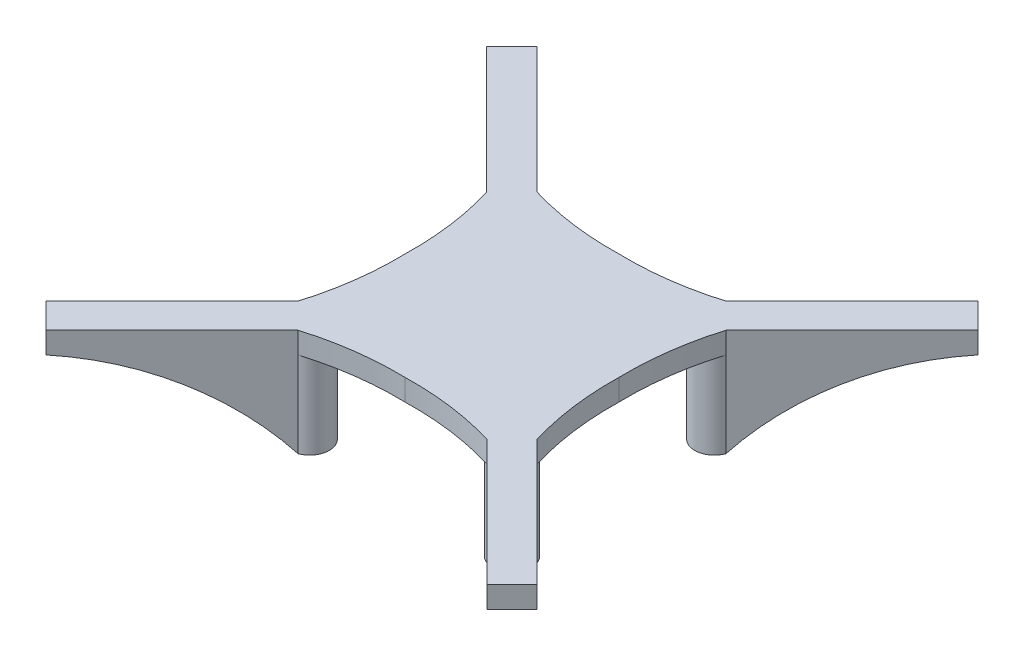
ISO-10303-21;
HEADER;
FILE_DESCRIPTION(('STEP AP214'),'2;1');
FILE_NAME('part.step','',(''),(''),'','','');
FILE_SCHEMA(('AUTOMOTIVE_DESIGN { 1 0 10303 214 1 1 1 1 }'));
ENDSEC;
DATA;
#1=APPLICATION_CONTEXT('core data for automotive mechanical design processes');
#2=APPLICATION_PROTOCOL_DEFINITION('international standard','automotive_design',2000,#1);
#3=PRODUCT_CONTEXT('',#1,'mechanical');
#4=PRODUCT('Part','Part','',(#3));
#5=PRODUCT_RELATED_PRODUCT_CATEGORY('part','',(#4));
#6=PRODUCT_DEFINITION_FORMATION('','',#4);
#7=PRODUCT_DEFINITION_CONTEXT('part definition',#1,'design');
#8=PRODUCT_DEFINITION('design','',#6,#7);
#9=PRODUCT_DEFINITION_SHAPE('','',#8);
#10=(LENGTH_UNIT() NAMED_UNIT(*) SI_UNIT(.MILLI.,.METRE.));
#11=(NAMED_UNIT(*) PLANE_ANGLE_UNIT() SI_UNIT($,.RADIAN.));
#12=(NAMED_UNIT(*) SI_UNIT($,.STERADIAN.) SOLID_ANGLE_UNIT());
#13=UNCERTAINTY_MEASURE_WITH_UNIT(LENGTH_MEASURE(1.E-05),#10,'distance_accuracy_value','');
#14=(GEOMETRIC_REPRESENTATION_CONTEXT(3) GLOBAL_UNCERTAINTY_ASSIGNED_CONTEXT((#13)) GLOBAL_UNIT_ASSIGNED_CONTEXT((#10,
#11,#12)) REPRESENTATION_CONTEXT('',''));
#15=CARTESIAN_POINT('',(0.,0.,0.));
#16=DIRECTION('',(0.,0.,1.));
#17=DIRECTION('',(1.,0.,0.));
#18=AXIS2_PLACEMENT_3D('',#15,#16,#17);
#19=CARTESIAN_POINT('',(-2.13393982171871,0.,-114.973209312331));
#20=DIRECTION('',(0.,1.,0.));
#21=DIRECTION('',(0.,0.,1.));
#22=AXIS2_PLACEMENT_3D('',#19,#20,#21);
#23=PLANE('',#22);
#24=DIRECTION('',(0.707106781186548,0.,0.707106781186547));
#25=VECTOR('',#24,1.);
#26=CARTESIAN_POINT('',(-47.6776695296649,0.,12.3223304703372));
#27=LINE('',#26,#25);
#28=CARTESIAN_POINT('',(-26.4644660940685,0.,33.5355339059336));
#29=VERTEX_POINT('',#28);
#30=CARTESIAN_POINT('',(-33.5355339059334,0.,26.4644660940676));
#31=VERTEX_POINT('',#30);
#32=EDGE_CURVE('E325',#29,#31,#27,.F.);
#33=ORIENTED_EDGE('',*,*,#32,.T.);
#34=CARTESIAN_POINT('',(-28.3798148253988,0.,28.3798148253987));
#35=DIRECTION('',(0.,1.,0.));
#36=DIRECTION('',(0.,0.,1.));
#37=AXIS2_PLACEMENT_3D('',#34,#35,#36);
#38=CIRCLE('',#37,5.5);
#39=EDGE_CURVE('E214',#29,#31,#38,.T.);
#40=ORIENTED_EDGE('',*,*,#39,.F.);
#41=EDGE_LOOP('',(#33,#40));
#42=FACE_BOUND('',#41,.T.);
#43=ADVANCED_FACE('F45',(#42),#23,.F.);
#44=DIRECTION('',(0.707106781186542,0.,-0.707106781186553));
#45=VECTOR('',#44,1.);
#46=CARTESIAN_POINT('',(12.3223304703362,0.,47.6776695296641));
#47=LINE('',#46,#45);
#48=CARTESIAN_POINT('',(33.5355339059325,0.,26.4644660940676));
#49=VERTEX_POINT('',#48);
#50=CARTESIAN_POINT('',(26.4644660940671,0.,33.535533905933));
#51=VERTEX_POINT('',#50);
#52=EDGE_CURVE('E321',#49,#51,#47,.F.);
#53=ORIENTED_EDGE('',*,*,#52,.T.);
#54=CARTESIAN_POINT('',(28.3798148253977,0.,28.3798148253983));
#55=DIRECTION('',(0.,1.,0.));
#56=DIRECTION('',(0.,0.,-1.));
#57=AXIS2_PLACEMENT_3D('',#54,#55,#56);
#58=CIRCLE('',#57,5.5);
#59=EDGE_CURVE('E233',#49,#51,#58,.T.);
#60=ORIENTED_EDGE('',*,*,#59,.F.);
#61=EDGE_LOOP('',(#53,#60));
#62=FACE_BOUND('',#61,.T.);
#63=ADVANCED_FACE('F597',(#62),#23,.F.);
#64=DIRECTION('',(-0.707106781186548,0.,-0.707106781186547));
#65=VECTOR('',#64,1.);
#66=CARTESIAN_POINT('',(47.6776695296637,0.,-12.3223304703364));
#67=LINE('',#66,#65);
#68=CARTESIAN_POINT('',(26.4644660940673,0.,-33.5355339059328));
#69=VERTEX_POINT('',#68);
#70=CARTESIAN_POINT('',(33.5355339059326,0.,-26.4644660940675));
#71=VERTEX_POINT('',#70);
#72=EDGE_CURVE('E54',#69,#71,#67,.F.);
#73=ORIENTED_EDGE('',*,*,#72,.T.);
#74=CARTESIAN_POINT('',(28.3798148253979,0.,-28.379814825398));
#75=DIRECTION('',(0.,1.,0.));
#76=DIRECTION('',(0.,0.,-1.));
#77=AXIS2_PLACEMENT_3D('',#74,#75,#76);
#78=CIRCLE('',#77,5.5);
#79=EDGE_CURVE('E338',#69,#71,#78,.T.);
#80=ORIENTED_EDGE('',*,*,#79,.F.);
#81=EDGE_LOOP('',(#73,#80));
#82=FACE_BOUND('',#81,.T.);
#83=ADVANCED_FACE('F337',(#82),#23,.F.);
#84=CARTESIAN_POINT('',(-68.9099878484196,30.,-61.8198051533944));
#85=DIRECTION('',(-0.707106781186547,0.,-0.707106781186547));
#86=DIRECTION('',(-0.707106781186548,0.,0.707106781186548));
#87=AXIS2_PLACEMENT_3D('',#84,#85,#86);
#88=PLANE('',#87);
#89=DIRECTION('',(-0.707106781186548,0.,0.707106781186547));
#90=VECTOR('',#89,1.);
#91=CARTESIAN_POINT('',(-47.6967844128232,24.,-83.0330085889909));
#92=LINE('',#91,#90);
#93=CARTESIAN_POINT('',(-61.8389200365542,24.,-68.8908729652599));
#94=VERTEX_POINT('',#93);
#95=CARTESIAN_POINT('',(-68.9099878484196,24.,-61.8198051533945));
#96=VERTEX_POINT('',#95);
#97=EDGE_CURVE('E367',#94,#96,#92,.T.);
#98=ORIENTED_EDGE('',*,*,#97,.T.);
#99=DIRECTION('',(0.,-1.,0.));
#100=VECTOR('',#99,1.);
#101=CARTESIAN_POINT('',(-68.9099878484196,30.,-61.8198051533944));
#102=LINE('',#101,#100);
#103=CARTESIAN_POINT('',(-68.9099878484196,30.,-61.8198051533944));
#104=VERTEX_POINT('',#103);
#105=EDGE_CURVE('E61',#104,#96,#102,.T.);
#106=ORIENTED_EDGE('',*,*,#105,.F.);
#107=DIRECTION('',(0.707106781186547,0.,-0.707106781186547));
#108=VECTOR('',#107,1.);
#109=CARTESIAN_POINT('',(-68.9099878484196,30.,-61.8198051533944));
#110=LINE('',#109,#108);
#111=CARTESIAN_POINT('',(-61.8389200365542,30.,-68.8908729652599));
#112=VERTEX_POINT('',#111);
#113=EDGE_CURVE('E395',#104,#112,#110,.T.);
#114=ORIENTED_EDGE('',*,*,#113,.T.);
#115=DIRECTION('',(0.,-1.,0.));
#116=VECTOR('',#115,1.);
#117=CARTESIAN_POINT('',(-61.8389200365542,30.,-68.8908729652599));
#118=LINE('',#117,#116);
#119=EDGE_CURVE('E317',#112,#94,#118,.T.);
#120=ORIENTED_EDGE('',*,*,#119,.T.);
#121=EDGE_LOOP('',(#98,#106,#114,#120));
#122=FACE_BOUND('',#121,.T.);
#123=ADVANCED_FACE('F47',(#122),#88,.T.);
#124=CARTESIAN_POINT('',(-68.9099878484196,30.,-61.8198051533944));
#125=DIRECTION('',(0.707106781186547,0.,-0.707106781186547));
#126=DIRECTION('',(-0.707106781186547,0.,-0.707106781186548));
#127=AXIS2_PLACEMENT_3D('',#124,#125,#126);
#128=PLANE('',#127);
#129=ORIENTED_EDGE('',*,*,#105,.T.);
#130=CARTESIAN_POINT('',(-72.5550291548391,-50.8226392728096,-65.464846459814));
#131=DIRECTION('',(-0.707106781186548,0.,0.707106781186547));
#132=DIRECTION('',(-0.707106781186547,0.,-0.707106781186548));
#133=AXIS2_PLACEMENT_3D('',#130,#131,#132);
#134=CIRCLE('',#133,75.);
#135=CARTESIAN_POINT('',(-33.5546487890922,0.,-26.4644660940671));
#136=VERTEX_POINT('',#135);
#137=EDGE_CURVE('E364',#136,#96,#134,.T.);
#138=ORIENTED_EDGE('',*,*,#137,.F.);
#139=DIRECTION('',(0.,-1.,0.));
#140=VECTOR('',#139,1.);
#141=CARTESIAN_POINT('',(-33.5546487890922,24.,-26.4644660940671));
#142=LINE('',#141,#140);
#143=CARTESIAN_POINT('',(-33.5546487890922,24.,-26.4644660940671));
#144=VERTEX_POINT('',#143);
#145=EDGE_CURVE('E220',#144,#136,#142,.T.);
#146=ORIENTED_EDGE('',*,*,#145,.F.);
#147=DIRECTION('',(0.,-1.,0.));
#148=VECTOR('',#147,1.);
#149=CARTESIAN_POINT('',(-33.5546487890922,30.,-26.4644660940671));
#150=LINE('',#149,#148);
#151=CARTESIAN_POINT('',(-33.5546487890922,30.,-26.4644660940671));
#152=VERTEX_POINT('',#151);
#153=EDGE_CURVE('E255',#152,#144,#150,.T.);
#154=ORIENTED_EDGE('',*,*,#153,.F.);
#155=DIRECTION('',(0.707106781186547,0.,0.707106781186547));
#156=VECTOR('',#155,1.);
#157=CARTESIAN_POINT('',(-68.9099878484196,30.,-61.8198051533944));
#158=LINE('',#157,#156);
#159=EDGE_CURVE('E68',#104,#152,#158,.T.);
#160=ORIENTED_EDGE('',*,*,#159,.F.);
#161=EDGE_LOOP('',(#129,#138,#146,#154,#160));
#162=FACE_BOUND('',#161,.T.);
#163=ADVANCED_FACE('F468',(#162),#128,.F.);
#164=CARTESIAN_POINT('',(-114.975099606415,30.,-2.05729115095129));
#165=DIRECTION('',(0.,-1.,0.));
#166=DIRECTION('',(0.,0.,-1.));
#167=AXIS2_PLACEMENT_3D('',#164,#165,#166);
#168=CYLINDRICAL_SURFACE('',#167,85.);
#169=ORIENTED_EDGE('',*,*,#153,.T.);
#170=CARTESIAN_POINT('',(-114.975099606415,24.,-2.05729115095129));
#171=DIRECTION('',(0.,1.,0.));
#172=DIRECTION('',(0.,0.,1.));
#173=AXIS2_PLACEMENT_3D('',#170,#171,#172);
#174=CIRCLE('',#173,85.);
#175=CARTESIAN_POINT('',(-30.,24.,0.));
#176=VERTEX_POINT('',#175);
#177=EDGE_CURVE('E244',#144,#176,#174,.F.);
#178=ORIENTED_EDGE('',*,*,#177,.T.);
#179=DIRECTION('',(0.,-1.,0.));
#180=VECTOR('',#179,1.);
#181=CARTESIAN_POINT('',(-30.,30.,0.));
#182=LINE('',#181,#180);
#183=CARTESIAN_POINT('',(-30.,30.,0.));
#184=VERTEX_POINT('',#183);
#185=EDGE_CURVE('E242',#184,#176,#182,.T.);
#186=ORIENTED_EDGE('',*,*,#185,.F.);
#187=CARTESIAN_POINT('',(-114.975099606415,30.,-2.05729115095129));
#188=DIRECTION('',(0.,-1.,0.));
#189=DIRECTION('',(0.,0.,-1.));
#190=AXIS2_PLACEMENT_3D('',#187,#188,#189);
#191=CIRCLE('',#190,85.);
#192=EDGE_CURVE('E455',#152,#184,#191,.T.);
#193=ORIENTED_EDGE('',*,*,#192,.F.);
#194=EDGE_LOOP('',(#169,#178,#186,#193));
#195=FACE_BOUND('',#194,.T.);
#196=ADVANCED_FACE('F465',(#195),#168,.F.);
#197=CARTESIAN_POINT('',(-114.97365046039,30.,2.1163004123836));
#198=DIRECTION('',(0.,-1.,0.));
#199=DIRECTION('',(0.,0.,-1.));
#200=AXIS2_PLACEMENT_3D('',#197,#198,#199);
#201=CYLINDRICAL_SURFACE('',#200,85.);
#202=CARTESIAN_POINT('',(-114.97365046039,24.,2.1163004123836));
#203=DIRECTION('',(0.,1.,0.));
#204=DIRECTION('',(0.,0.,1.));
#205=AXIS2_PLACEMENT_3D('',#202,#203,#204);
#206=CIRCLE('',#205,85.);
#207=CARTESIAN_POINT('',(-33.5355339059334,24.,26.4644660940676));
#208=VERTEX_POINT('',#207);
#209=EDGE_CURVE('E227',#208,#176,#206,.T.);
#210=ORIENTED_EDGE('',*,*,#209,.F.);
#211=DIRECTION('',(0.,-1.,0.));
#212=VECTOR('',#211,1.);
#213=CARTESIAN_POINT('',(-33.5355339059334,30.,26.4644660940676));
#214=LINE('',#213,#212);
#215=CARTESIAN_POINT('',(-33.5355339059334,30.,26.4644660940676));
#216=VERTEX_POINT('',#215);
#217=EDGE_CURVE('E239',#216,#208,#214,.T.);
#218=ORIENTED_EDGE('',*,*,#217,.F.);
#219=CARTESIAN_POINT('',(-114.97365046039,30.,2.1163004123836));
#220=DIRECTION('',(0.,1.,0.));
#221=DIRECTION('',(0.,0.,1.));
#222=AXIS2_PLACEMENT_3D('',#219,#220,#221);
#223=CIRCLE('',#222,85.);
#224=EDGE_CURVE('E452',#216,#184,#223,.T.);
#225=ORIENTED_EDGE('',*,*,#224,.T.);
#226=ORIENTED_EDGE('',*,*,#185,.T.);
#227=EDGE_LOOP('',(#210,#218,#225,#226));
#228=FACE_BOUND('',#227,.T.);
#229=ADVANCED_FACE('F237',(#228),#201,.F.);
#230=CARTESIAN_POINT('',(-68.8908729652608,30.,61.8198051533949));
#231=DIRECTION('',(-0.707106781186547,0.,-0.707106781186548));
#232=DIRECTION('',(-0.707106781186548,0.,0.707106781186547));
#233=AXIS2_PLACEMENT_3D('',#230,#231,#232);
#234=PLANE('',#233);
#235=CARTESIAN_POINT('',(-72.5359142716808,-50.8226392728096,65.464846459815));
#236=DIRECTION('',(-0.707106781186547,0.,-0.707106781186548));
#237=DIRECTION('',(-0.707106781186548,0.,0.707106781186547));
#238=AXIS2_PLACEMENT_3D('',#235,#236,#237);
#239=CIRCLE('',#238,75.);
#240=CARTESIAN_POINT('',(-68.8908729652602,24.,61.8198051533966));
#241=VERTEX_POINT('',#240);
#242=EDGE_CURVE('E381',#241,#31,#239,.T.);
#243=ORIENTED_EDGE('',*,*,#242,.F.);
#244=DIRECTION('',(0.,-1.,0.));
#245=VECTOR('',#244,1.);
#246=CARTESIAN_POINT('',(-68.8908729652608,30.,61.8198051533949));
#247=LINE('',#246,#245);
#248=CARTESIAN_POINT('',(-68.8908729652608,30.,61.8198051533949));
#249=VERTEX_POINT('',#248);
#250=EDGE_CURVE('E251',#249,#241,#247,.T.);
#251=ORIENTED_EDGE('',*,*,#250,.F.);
#252=DIRECTION('',(0.707106781186548,0.,-0.707106781186547));
#253=VECTOR('',#252,1.);
#254=CARTESIAN_POINT('',(-68.8908729652608,30.,61.8198051533949));
#255=LINE('',#254,#253);
#256=EDGE_CURVE('E249',#249,#216,#255,.T.);
#257=ORIENTED_EDGE('',*,*,#256,.T.);
#258=ORIENTED_EDGE('',*,*,#217,.T.);
#259=DIRECTION('',(0.,-1.,0.));
#260=VECTOR('',#259,1.);
#261=CARTESIAN_POINT('',(-33.5355339059334,24.,26.4644660940676));
#262=LINE('',#261,#260);
#263=EDGE_CURVE('E208',#208,#31,#262,.T.);
#264=ORIENTED_EDGE('',*,*,#263,.T.);
#265=EDGE_LOOP('',(#243,#251,#257,#258,#264));
#266=FACE_BOUND('',#265,.T.);
#267=ADVANCED_FACE('F247',(#266),#234,.T.);
#268=CARTESIAN_POINT('',(-61.8198051533959,30.,68.890872965261));
#269=DIRECTION('',(-0.707106781186605,0.,0.70710678118649));
#270=DIRECTION('',(0.70710678118649,0.,0.707106781186605));
#271=AXIS2_PLACEMENT_3D('',#268,#269,#270);
#272=PLANE('',#271);
#273=DIRECTION('',(0.707106781186548,0.,0.707106781186547));
#274=VECTOR('',#273,1.);
#275=CARTESIAN_POINT('',(-83.0330085889923,24.,47.6776695296646));
#276=LINE('',#275,#274);
#277=CARTESIAN_POINT('',(-61.8198051533958,24.,68.890872965261));
#278=VERTEX_POINT('',#277);
#279=EDGE_CURVE('E377',#241,#278,#276,.T.);
#280=ORIENTED_EDGE('',*,*,#279,.T.);
#281=DIRECTION('',(0.,-1.,0.));
#282=VECTOR('',#281,1.);
#283=CARTESIAN_POINT('',(-61.8198051533959,30.,68.890872965261));
#284=LINE('',#283,#282);
#285=CARTESIAN_POINT('',(-61.8198051533959,30.,68.890872965261));
#286=VERTEX_POINT('',#285);
#287=EDGE_CURVE('E258',#286,#278,#284,.T.);
#288=ORIENTED_EDGE('',*,*,#287,.F.);
#289=DIRECTION('',(-0.70710678118649,0.,-0.707106781186605));
#290=VECTOR('',#289,1.);
#291=CARTESIAN_POINT('',(-61.8198051533959,30.,68.890872965261));
#292=LINE('',#291,#290);
#293=EDGE_CURVE('E446',#286,#249,#292,.T.);
#294=ORIENTED_EDGE('',*,*,#293,.T.);
#295=ORIENTED_EDGE('',*,*,#250,.T.);
#296=EDGE_LOOP('',(#280,#288,#294,#295));
#297=FACE_BOUND('',#296,.T.);
#298=ADVANCED_FACE('F634',(#297),#272,.T.);
#299=CARTESIAN_POINT('',(-61.8198051533959,30.,68.890872965261));
#300=DIRECTION('',(-0.707106781186547,0.,-0.707106781186547));
#301=DIRECTION('',(-0.707106781186548,0.,0.707106781186548));
#302=AXIS2_PLACEMENT_3D('',#299,#300,#301);
#303=PLANE('',#302);
#304=ORIENTED_EDGE('',*,*,#287,.T.);
#305=CARTESIAN_POINT('',(-65.4648464598153,-50.8226392728096,72.5359142716805));
#306=DIRECTION('',(0.707106781186548,0.,0.707106781186547));
#307=DIRECTION('',(-0.707106781186547,0.,0.707106781186548));
#308=AXIS2_PLACEMENT_3D('',#305,#306,#307);
#309=CIRCLE('',#308,75.);
#310=EDGE_CURVE('E374',#29,#278,#309,.T.);
#311=ORIENTED_EDGE('',*,*,#310,.F.);
#312=DIRECTION('',(0.,-1.,0.));
#313=VECTOR('',#312,1.);
#314=CARTESIAN_POINT('',(-26.4644660940685,24.,33.5355339059336));
#315=LINE('',#314,#313);
#316=CARTESIAN_POINT('',(-26.4644660940685,24.,33.5355339059336));
#317=VERTEX_POINT('',#316);
#318=EDGE_CURVE('E486',#317,#29,#315,.T.);
#319=ORIENTED_EDGE('',*,*,#318,.F.);
#320=DIRECTION('',(0.,-1.,0.));
#321=VECTOR('',#320,1.);
#322=CARTESIAN_POINT('',(-26.4644660940685,30.,33.5355339059336));
#323=LINE('',#322,#321);
#324=CARTESIAN_POINT('',(-26.4644660940685,30.,33.5355339059336));
#325=VERTEX_POINT('',#324);
#326=EDGE_CURVE('E265',#325,#317,#323,.T.);
#327=ORIENTED_EDGE('',*,*,#326,.F.);
#328=DIRECTION('',(0.707106781186547,0.,-0.707106781186547));
#329=VECTOR('',#328,1.);
#330=CARTESIAN_POINT('',(-61.8198051533959,30.,68.890872965261));
#331=LINE('',#330,#329);
#332=EDGE_CURVE('E443',#286,#325,#331,.T.);
#333=ORIENTED_EDGE('',*,*,#332,.F.);
#334=EDGE_LOOP('',(#304,#311,#319,#327,#333));
#335=FACE_BOUND('',#334,.T.);
#336=ADVANCED_FACE('F636',(#335),#303,.F.);
#337=CARTESIAN_POINT('',(-2.11630041238379,30.,114.97365046039));
#338=DIRECTION('',(0.,-1.,0.));
#339=DIRECTION('',(0.,0.,-1.));
#340=AXIS2_PLACEMENT_3D('',#337,#338,#339);
#341=CYLINDRICAL_SURFACE('',#340,85.);
#342=ORIENTED_EDGE('',*,*,#326,.T.);
#343=CARTESIAN_POINT('',(-2.11630041238379,24.,114.97365046039));
#344=DIRECTION('',(0.,1.,0.));
#345=DIRECTION('',(0.,0.,1.));
#346=AXIS2_PLACEMENT_3D('',#343,#344,#345);
#347=CIRCLE('',#346,85.);
#348=CARTESIAN_POINT('',(0.,24.,30.));
#349=VERTEX_POINT('',#348);
#350=EDGE_CURVE('E230',#317,#349,#347,.F.);
#351=ORIENTED_EDGE('',*,*,#350,.T.);
#352=DIRECTION('',(0.,-1.,0.));
#353=VECTOR('',#352,1.);
#354=CARTESIAN_POINT('',(0.,30.,30.));
#355=LINE('',#354,#353);
#356=CARTESIAN_POINT('',(0.,30.,30.));
#357=VERTEX_POINT('',#356);
#358=EDGE_CURVE('E269',#357,#349,#355,.T.);
#359=ORIENTED_EDGE('',*,*,#358,.F.);
#360=CARTESIAN_POINT('',(-2.11630041238379,30.,114.97365046039));
#361=DIRECTION('',(0.,-1.,0.));
#362=DIRECTION('',(0.,0.,-1.));
#363=AXIS2_PLACEMENT_3D('',#360,#361,#362);
#364=CIRCLE('',#363,85.);
#365=EDGE_CURVE('E440',#325,#357,#364,.T.);
#366=ORIENTED_EDGE('',*,*,#365,.F.);
#367=EDGE_LOOP('',(#342,#351,#359,#366));
#368=FACE_BOUND('',#367,.T.);
#369=ADVANCED_FACE('F499',(#368),#341,.F.);
#370=CARTESIAN_POINT('',(2.11630041238427,30.,114.97365046039));
#371=DIRECTION('',(0.,-1.,0.));
#372=DIRECTION('',(0.,0.,-1.));
#373=AXIS2_PLACEMENT_3D('',#370,#371,#372);
#374=CYLINDRICAL_SURFACE('',#373,85.);
#375=CARTESIAN_POINT('',(2.11630041238427,24.,114.97365046039));
#376=DIRECTION('',(0.,1.,0.));
#377=DIRECTION('',(0.,0.,1.));
#378=AXIS2_PLACEMENT_3D('',#375,#376,#377);
#379=CIRCLE('',#378,85.);
#380=CARTESIAN_POINT('',(26.4644660940671,24.,33.535533905933));
#381=VERTEX_POINT('',#380);
#382=EDGE_CURVE('E493',#381,#349,#379,.T.);
#383=ORIENTED_EDGE('',*,*,#382,.F.);
#384=DIRECTION('',(0.,-1.,0.));
#385=VECTOR('',#384,1.);
#386=CARTESIAN_POINT('',(26.4644660940671,30.,33.535533905933));
#387=LINE('',#386,#385);
#388=CARTESIAN_POINT('',(26.4644660940671,30.,33.535533905933));
#389=VERTEX_POINT('',#388);
#390=EDGE_CURVE('E273',#389,#381,#387,.T.);
#391=ORIENTED_EDGE('',*,*,#390,.F.);
#392=CARTESIAN_POINT('',(2.11630041238427,30.,114.97365046039));
#393=DIRECTION('',(0.,1.,0.));
#394=DIRECTION('',(0.,0.,1.));
#395=AXIS2_PLACEMENT_3D('',#392,#393,#394);
#396=CIRCLE('',#395,85.);
#397=EDGE_CURVE('E436',#389,#357,#396,.T.);
#398=ORIENTED_EDGE('',*,*,#397,.T.);
#399=ORIENTED_EDGE('',*,*,#358,.T.);
#400=EDGE_LOOP('',(#383,#391,#398,#399));
#401=FACE_BOUND('',#400,.T.);
#402=ADVANCED_FACE('F504',(#401),#374,.F.);
#403=CARTESIAN_POINT('',(61.8198051533946,30.,68.89087296526));
#404=DIRECTION('',(-0.707106781186542,0.,0.707106781186553));
#405=DIRECTION('',(0.707106781186553,0.,0.707106781186542));
#406=AXIS2_PLACEMENT_3D('',#403,#404,#405);
#407=PLANE('',#406);
#408=CARTESIAN_POINT('',(65.4648464598143,-50.8226392728096,72.5359142716796));
#409=DIRECTION('',(-0.707106781186542,0.,0.707106781186553));
#410=DIRECTION('',(0.707106781186553,0.,0.707106781186542));
#411=AXIS2_PLACEMENT_3D('',#408,#409,#410);
#412=CIRCLE('',#411,75.);
#413=CARTESIAN_POINT('',(61.8198051533946,24.,68.89087296526));
#414=VERTEX_POINT('',#413);
#415=EDGE_CURVE('E391',#414,#51,#412,.T.);
#416=ORIENTED_EDGE('',*,*,#415,.F.);
#417=DIRECTION('',(0.,-1.,0.));
#418=VECTOR('',#417,1.);
#419=CARTESIAN_POINT('',(61.8198051533946,30.,68.89087296526));
#420=LINE('',#419,#418);
#421=CARTESIAN_POINT('',(61.8198051533946,30.,68.89087296526));
#422=VERTEX_POINT('',#421);
#423=EDGE_CURVE('E277',#422,#414,#420,.T.);
#424=ORIENTED_EDGE('',*,*,#423,.F.);
#425=DIRECTION('',(-0.707106781186553,0.,-0.707106781186542));
#426=VECTOR('',#425,1.);
#427=CARTESIAN_POINT('',(61.8198051533946,30.,68.89087296526));
#428=LINE('',#427,#426);
#429=EDGE_CURVE('E432',#422,#389,#428,.T.);
#430=ORIENTED_EDGE('',*,*,#429,.T.);
#431=ORIENTED_EDGE('',*,*,#390,.T.);
#432=DIRECTION('',(0.,-1.,0.));
#433=VECTOR('',#432,1.);
#434=CARTESIAN_POINT('',(26.4644660940671,24.,33.535533905933));
#435=LINE('',#434,#433);
#436=EDGE_CURVE('E568',#381,#51,#435,.T.);
#437=ORIENTED_EDGE('',*,*,#436,.T.);
#438=EDGE_LOOP('',(#416,#424,#430,#431,#437));
#439=FACE_BOUND('',#438,.T.);
#440=ADVANCED_FACE('F510',(#439),#407,.T.);
#441=CARTESIAN_POINT('',(61.8198051533946,30.,68.89087296526));
#442=DIRECTION('',(-0.707106781186553,0.,-0.707106781186542));
#443=DIRECTION('',(-0.707106781186542,0.,0.707106781186553));
#444=AXIS2_PLACEMENT_3D('',#441,#442,#443);
#445=PLANE('',#444);
#446=ORIENTED_EDGE('',*,*,#423,.T.);
#447=DIRECTION('',(0.707106781186542,0.,-0.707106781186553));
#448=VECTOR('',#447,1.);
#449=CARTESIAN_POINT('',(47.6776695296637,24.,83.0330085889911));
#450=LINE('',#449,#448);
#451=CARTESIAN_POINT('',(68.8908729652599,24.,61.8198051533945));
#452=VERTEX_POINT('',#451);
#453=EDGE_CURVE('E387',#414,#452,#450,.T.);
#454=ORIENTED_EDGE('',*,*,#453,.T.);
#455=DIRECTION('',(0.,-1.,0.));
#456=VECTOR('',#455,1.);
#457=CARTESIAN_POINT('',(68.89087296526,30.,61.8198051533945));
#458=LINE('',#457,#456);
#459=CARTESIAN_POINT('',(68.89087296526,30.,61.8198051533945));
#460=VERTEX_POINT('',#459);
#461=EDGE_CURVE('E281',#460,#452,#458,.T.);
#462=ORIENTED_EDGE('',*,*,#461,.F.);
#463=DIRECTION('',(0.707106781186542,0.,-0.707106781186553));
#464=VECTOR('',#463,1.);
#465=CARTESIAN_POINT('',(61.8198051533946,30.,68.89087296526));
#466=LINE('',#465,#464);
#467=EDGE_CURVE('E429',#422,#460,#466,.T.);
#468=ORIENTED_EDGE('',*,*,#467,.F.);
#469=EDGE_LOOP('',(#446,#454,#462,#468));
#470=FACE_BOUND('',#469,.T.);
#471=ADVANCED_FACE('F515',(#470),#445,.F.);
#472=CARTESIAN_POINT('',(68.89087296526,30.,61.8198051533945));
#473=DIRECTION('',(-0.707106781186542,0.,0.707106781186553));
#474=DIRECTION('',(0.707106781186553,0.,0.707106781186542));
#475=AXIS2_PLACEMENT_3D('',#472,#473,#474);
#476=PLANE('',#475);
#477=ORIENTED_EDGE('',*,*,#461,.T.);
#478=CARTESIAN_POINT('',(72.5359142716797,-50.8226392728096,65.4648464598142));
#479=DIRECTION('',(0.707106781186542,0.,-0.707106781186553));
#480=DIRECTION('',(0.707106781186553,0.,0.707106781186542));
#481=AXIS2_PLACEMENT_3D('',#478,#479,#480);
#482=CIRCLE('',#481,75.);
#483=EDGE_CURVE('E384',#49,#452,#482,.T.);
#484=ORIENTED_EDGE('',*,*,#483,.F.);
#485=DIRECTION('',(0.,-1.,0.));
#486=VECTOR('',#485,1.);
#487=CARTESIAN_POINT('',(33.5355339059325,24.,26.4644660940676));
#488=LINE('',#487,#486);
#489=CARTESIAN_POINT('',(33.5355339059325,24.,26.4644660940676));
#490=VERTEX_POINT('',#489);
#491=EDGE_CURVE('E525',#490,#49,#488,.T.);
#492=ORIENTED_EDGE('',*,*,#491,.F.);
#493=DIRECTION('',(0.,-1.,0.));
#494=VECTOR('',#493,1.);
#495=CARTESIAN_POINT('',(33.5355339059325,30.,26.4644660940676));
#496=LINE('',#495,#494);
#497=CARTESIAN_POINT('',(33.5355339059325,30.,26.4644660940676));
#498=VERTEX_POINT('',#497);
#499=EDGE_CURVE('E285',#498,#490,#496,.T.);
#500=ORIENTED_EDGE('',*,*,#499,.F.);
#501=DIRECTION('',(-0.707106781186553,0.,-0.707106781186542));
#502=VECTOR('',#501,1.);
#503=CARTESIAN_POINT('',(68.89087296526,30.,61.8198051533945));
#504=LINE('',#503,#502);
#505=EDGE_CURVE('E426',#460,#498,#504,.T.);
#506=ORIENTED_EDGE('',*,*,#505,.F.);
#507=EDGE_LOOP('',(#477,#484,#492,#500,#506));
#508=FACE_BOUND('',#507,.T.);
#509=ADVANCED_FACE('F523',(#508),#476,.F.);
#510=CARTESIAN_POINT('',(114.97365046039,30.,2.11630041238641));
#511=DIRECTION('',(0.,-1.,0.));
#512=DIRECTION('',(0.,0.,-1.));
#513=AXIS2_PLACEMENT_3D('',#510,#511,#512);
#514=CYLINDRICAL_SURFACE('',#513,85.);
#515=ORIENTED_EDGE('',*,*,#499,.T.);
#516=CARTESIAN_POINT('',(114.97365046039,24.,2.11630041238641));
#517=DIRECTION('',(0.,1.,0.));
#518=DIRECTION('',(0.,0.,1.));
#519=AXIS2_PLACEMENT_3D('',#516,#517,#518);
#520=CIRCLE('',#519,85.);
#521=CARTESIAN_POINT('',(30.,24.,0.));
#522=VERTEX_POINT('',#521);
#523=EDGE_CURVE('E489',#490,#522,#520,.F.);
#524=ORIENTED_EDGE('',*,*,#523,.T.);
#525=DIRECTION('',(0.,-1.,0.));
#526=VECTOR('',#525,1.);
#527=CARTESIAN_POINT('',(30.,30.,0.));
#528=LINE('',#527,#526);
#529=CARTESIAN_POINT('',(30.,30.,0.));
#530=VERTEX_POINT('',#529);
#531=EDGE_CURVE('E289',#530,#522,#528,.T.);
#532=ORIENTED_EDGE('',*,*,#531,.F.);
#533=CARTESIAN_POINT('',(114.97365046039,30.,2.11630041238641));
#534=DIRECTION('',(0.,-1.,0.));
#535=DIRECTION('',(0.,0.,-1.));
#536=AXIS2_PLACEMENT_3D('',#533,#534,#535);
#537=CIRCLE('',#536,85.);
#538=EDGE_CURVE('E423',#498,#530,#537,.T.);
#539=ORIENTED_EDGE('',*,*,#538,.F.);
#540=EDGE_LOOP('',(#515,#524,#532,#539));
#541=FACE_BOUND('',#540,.T.);
#542=ADVANCED_FACE('F527',(#541),#514,.F.);
#543=CARTESIAN_POINT('',(114.97365046039,30.,-2.11630041238581));
#544=DIRECTION('',(0.,-1.,0.));
#545=DIRECTION('',(0.,0.,-1.));
#546=AXIS2_PLACEMENT_3D('',#543,#544,#545);
#547=CYLINDRICAL_SURFACE('',#546,85.);
#548=CARTESIAN_POINT('',(114.97365046039,24.,-2.11630041238581));
#549=DIRECTION('',(0.,1.,0.));
#550=DIRECTION('',(0.,0.,1.));
#551=AXIS2_PLACEMENT_3D('',#548,#549,#550);
#552=CIRCLE('',#551,85.);
#553=CARTESIAN_POINT('',(33.5355339059326,24.,-26.4644660940675));
#554=VERTEX_POINT('',#553);
#555=EDGE_CURVE('E485',#554,#522,#552,.T.);
#556=ORIENTED_EDGE('',*,*,#555,.F.);
#557=DIRECTION('',(0.,-1.,0.));
#558=VECTOR('',#557,1.);
#559=CARTESIAN_POINT('',(33.5355339059326,30.,-26.4644660940675));
#560=LINE('',#559,#558);
#561=CARTESIAN_POINT('',(33.5355339059326,30.,-26.4644660940675));
#562=VERTEX_POINT('',#561);
#563=EDGE_CURVE('E293',#562,#554,#560,.T.);
#564=ORIENTED_EDGE('',*,*,#563,.F.);
#565=CARTESIAN_POINT('',(114.97365046039,30.,-2.11630041238581));
#566=DIRECTION('',(0.,1.,0.));
#567=DIRECTION('',(0.,0.,1.));
#568=AXIS2_PLACEMENT_3D('',#565,#566,#567);
#569=CIRCLE('',#568,85.);
#570=EDGE_CURVE('E419',#562,#530,#569,.T.);
#571=ORIENTED_EDGE('',*,*,#570,.T.);
#572=ORIENTED_EDGE('',*,*,#531,.T.);
#573=EDGE_LOOP('',(#556,#564,#571,#572));
#574=FACE_BOUND('',#573,.T.);
#575=ADVANCED_FACE('F530',(#574),#547,.F.);
#576=CARTESIAN_POINT('',(68.89087296526,30.,-61.8198051533949));
#577=DIRECTION('',(0.707106781186547,0.,0.707106781186547));
#578=DIRECTION('',(0.707106781186547,0.,-0.707106781186548));
#579=AXIS2_PLACEMENT_3D('',#576,#577,#578);
#580=PLANE('',#579);
#581=CARTESIAN_POINT('',(72.5359142716795,-50.8226392728096,-65.4648464598144));
#582=DIRECTION('',(0.707106781186547,0.,0.707106781186547));
#583=DIRECTION('',(0.707106781186547,0.,-0.707106781186548));
#584=AXIS2_PLACEMENT_3D('',#581,#582,#583);
#585=CIRCLE('',#584,75.);
#586=CARTESIAN_POINT('',(68.89087296526,24.,-61.8198051533949));
#587=VERTEX_POINT('',#586);
#588=EDGE_CURVE('E346',#587,#71,#585,.T.);
#589=ORIENTED_EDGE('',*,*,#588,.F.);
#590=DIRECTION('',(0.,-1.,0.));
#591=VECTOR('',#590,1.);
#592=CARTESIAN_POINT('',(68.89087296526,30.,-61.8198051533949));
#593=LINE('',#592,#591);
#594=CARTESIAN_POINT('',(68.89087296526,30.,-61.8198051533949));
#595=VERTEX_POINT('',#594);
#596=EDGE_CURVE('E297',#595,#587,#593,.T.);
#597=ORIENTED_EDGE('',*,*,#596,.F.);
#598=DIRECTION('',(-0.707106781186547,0.,0.707106781186547));
#599=VECTOR('',#598,1.);
#600=CARTESIAN_POINT('',(68.89087296526,30.,-61.8198051533949));
#601=LINE('',#600,#599);
#602=EDGE_CURVE('E415',#595,#562,#601,.T.);
#603=ORIENTED_EDGE('',*,*,#602,.T.);
#604=ORIENTED_EDGE('',*,*,#563,.T.);
#605=DIRECTION('',(0.,-1.,0.));
#606=VECTOR('',#605,1.);
#607=CARTESIAN_POINT('',(33.5355339059326,24.,-26.4644660940675));
#608=LINE('',#607,#606);
#609=EDGE_CURVE('E573',#554,#71,#608,.T.);
#610=ORIENTED_EDGE('',*,*,#609,.T.);
#611=EDGE_LOOP('',(#589,#597,#603,#604,#610));
#612=FACE_BOUND('',#611,.T.);
#613=ADVANCED_FACE('F533',(#612),#580,.T.);
#614=CARTESIAN_POINT('',(68.89087296526,30.,-61.8198051533949));
#615=DIRECTION('',(-0.707106781186547,0.,0.707106781186547));
#616=DIRECTION('',(0.707106781186548,0.,0.707106781186548));
#617=AXIS2_PLACEMENT_3D('',#614,#615,#616);
#618=PLANE('',#617);
#619=ORIENTED_EDGE('',*,*,#596,.T.);
#620=DIRECTION('',(-0.707106781186548,0.,-0.707106781186547));
#621=VECTOR('',#620,1.);
#622=CARTESIAN_POINT('',(83.0330085889911,24.,-47.6776695296638));
#623=LINE('',#622,#621);
#624=CARTESIAN_POINT('',(61.8198051533946,24.,-68.8908729652602));
#625=VERTEX_POINT('',#624);
#626=EDGE_CURVE('E355',#587,#625,#623,.T.);
#627=ORIENTED_EDGE('',*,*,#626,.T.);
#628=DIRECTION('',(0.,-1.,0.));
#629=VECTOR('',#628,1.);
#630=CARTESIAN_POINT('',(61.8198051533946,30.,-68.8908729652602));
#631=LINE('',#630,#629);
#632=CARTESIAN_POINT('',(61.8198051533946,30.,-68.8908729652602));
#633=VERTEX_POINT('',#632);
#634=EDGE_CURVE('E301',#633,#625,#631,.T.);
#635=ORIENTED_EDGE('',*,*,#634,.F.);
#636=DIRECTION('',(-0.707106781186548,0.,-0.707106781186548));
#637=VECTOR('',#636,1.);
#638=CARTESIAN_POINT('',(68.89087296526,30.,-61.8198051533949));
#639=LINE('',#638,#637);
#640=EDGE_CURVE('E412',#595,#633,#639,.T.);
#641=ORIENTED_EDGE('',*,*,#640,.F.);
#642=EDGE_LOOP('',(#619,#627,#635,#641));
#643=FACE_BOUND('',#642,.T.);
#644=ADVANCED_FACE('F537',(#643),#618,.F.);
#645=CARTESIAN_POINT('',(61.8198051533946,30.,-68.8908729652602));
#646=DIRECTION('',(0.707106781186548,0.,0.707106781186547));
#647=DIRECTION('',(0.707106781186547,0.,-0.707106781186548));
#648=AXIS2_PLACEMENT_3D('',#645,#646,#647);
#649=PLANE('',#648);
#650=ORIENTED_EDGE('',*,*,#634,.T.);
#651=CARTESIAN_POINT('',(65.4648464598142,-50.8226392728096,-72.5359142716797));
#652=DIRECTION('',(-0.707106781186548,0.,-0.707106781186547));
#653=DIRECTION('',(0.707106781186547,0.,-0.707106781186548));
#654=AXIS2_PLACEMENT_3D('',#651,#652,#653);
#655=CIRCLE('',#654,75.);
#656=EDGE_CURVE('E343',#69,#625,#655,.T.);
#657=ORIENTED_EDGE('',*,*,#656,.F.);
#658=DIRECTION('',(0.,-1.,0.));
#659=VECTOR('',#658,1.);
#660=CARTESIAN_POINT('',(26.4644660940673,24.,-33.5355339059328));
#661=LINE('',#660,#659);
#662=CARTESIAN_POINT('',(26.4644660940673,24.,-33.5355339059328));
#663=VERTEX_POINT('',#662);
#664=EDGE_CURVE('E351',#663,#69,#661,.T.);
#665=ORIENTED_EDGE('',*,*,#664,.F.);
#666=DIRECTION('',(0.,-1.,0.));
#667=VECTOR('',#666,1.);
#668=CARTESIAN_POINT('',(26.4644660940673,30.,-33.5355339059328));
#669=LINE('',#668,#667);
#670=CARTESIAN_POINT('',(26.4644660940673,30.,-33.5355339059328));
#671=VERTEX_POINT('',#670);
#672=EDGE_CURVE('E305',#671,#663,#669,.T.);
#673=ORIENTED_EDGE('',*,*,#672,.F.);
#674=DIRECTION('',(-0.707106781186547,0.,0.707106781186548));
#675=VECTOR('',#674,1.);
#676=CARTESIAN_POINT('',(61.8198051533946,30.,-68.8908729652602));
#677=LINE('',#676,#675);
#678=EDGE_CURVE('E409',#633,#671,#677,.T.);
#679=ORIENTED_EDGE('',*,*,#678,.F.);
#680=EDGE_LOOP('',(#650,#657,#665,#673,#679));
#681=FACE_BOUND('',#680,.T.);
#682=ADVANCED_FACE('F349',(#681),#649,.F.);
#683=CARTESIAN_POINT('',(2.11630041238509,30.,-114.97365046039));
#684=DIRECTION('',(0.,-1.,0.));
#685=DIRECTION('',(0.,0.,-1.));
#686=AXIS2_PLACEMENT_3D('',#683,#684,#685);
#687=CYLINDRICAL_SURFACE('',#686,85.);
#688=ORIENTED_EDGE('',*,*,#672,.T.);
#689=CARTESIAN_POINT('',(2.11630041238509,24.,-114.97365046039));
#690=DIRECTION('',(0.,1.,0.));
#691=DIRECTION('',(0.,0.,1.));
#692=AXIS2_PLACEMENT_3D('',#689,#690,#691);
#693=CIRCLE('',#692,85.);
#694=CARTESIAN_POINT('',(0.,24.,-30.));
#695=VERTEX_POINT('',#694);
#696=EDGE_CURVE('E481',#663,#695,#693,.F.);
#697=ORIENTED_EDGE('',*,*,#696,.T.);
#698=DIRECTION('',(0.,-1.,0.));
#699=VECTOR('',#698,1.);
#700=CARTESIAN_POINT('',(0.,30.,-30.));
#701=LINE('',#700,#699);
#702=CARTESIAN_POINT('',(0.,30.,-30.));
#703=VERTEX_POINT('',#702);
#704=EDGE_CURVE('E309',#703,#695,#701,.T.);
#705=ORIENTED_EDGE('',*,*,#704,.F.);
#706=CARTESIAN_POINT('',(2.11630041238509,30.,-114.97365046039));
#707=DIRECTION('',(0.,-1.,0.));
#708=DIRECTION('',(0.,0.,-1.));
#709=AXIS2_PLACEMENT_3D('',#706,#707,#708);
#710=CIRCLE('',#709,85.);
#711=EDGE_CURVE('E406',#671,#703,#710,.T.);
#712=ORIENTED_EDGE('',*,*,#711,.F.);
#713=EDGE_LOOP('',(#688,#697,#705,#712));
#714=FACE_BOUND('',#713,.T.);
#715=ADVANCED_FACE('F542',(#714),#687,.F.);
#716=CARTESIAN_POINT('',(-2.13393982171871,30.,-114.973209312331));
#717=DIRECTION('',(0.,-1.,0.));
#718=DIRECTION('',(0.,0.,-1.));
#719=AXIS2_PLACEMENT_3D('',#716,#717,#718);
#720=CYLINDRICAL_SURFACE('',#719,85.);
#721=CARTESIAN_POINT('',(-2.13393982171871,24.,-114.973209312331));
#722=DIRECTION('',(0.,1.,0.));
#723=DIRECTION('',(0.,0.,1.));
#724=AXIS2_PLACEMENT_3D('',#721,#722,#723);
#725=CIRCLE('',#724,85.);
#726=CARTESIAN_POINT('',(-26.4835809772268,24.,-33.5355339059325));
#727=VERTEX_POINT('',#726);
#728=EDGE_CURVE('E11',#727,#695,#725,.T.);
#729=ORIENTED_EDGE('',*,*,#728,.F.);
#730=DIRECTION('',(0.,-1.,0.));
#731=VECTOR('',#730,1.);
#732=CARTESIAN_POINT('',(-26.4835809772268,30.,-33.5355339059325));
#733=LINE('',#732,#731);
#734=CARTESIAN_POINT('',(-26.4835809772268,30.,-33.5355339059325));
#735=VERTEX_POINT('',#734);
#736=EDGE_CURVE('E313',#735,#727,#733,.T.);
#737=ORIENTED_EDGE('',*,*,#736,.F.);
#738=CARTESIAN_POINT('',(-2.13393982171871,30.,-114.973209312331));
#739=DIRECTION('',(0.,1.,0.));
#740=DIRECTION('',(0.,0.,1.));
#741=AXIS2_PLACEMENT_3D('',#738,#739,#740);
#742=CIRCLE('',#741,85.);
#743=EDGE_CURVE('E402',#735,#703,#742,.T.);
#744=ORIENTED_EDGE('',*,*,#743,.T.);
#745=ORIENTED_EDGE('',*,*,#704,.T.);
#746=EDGE_LOOP('',(#729,#737,#744,#745));
#747=FACE_BOUND('',#746,.T.);
#748=ADVANCED_FACE('F545',(#747),#720,.F.);
#749=CARTESIAN_POINT('',(-61.8389200365542,30.,-68.8908729652599));
#750=DIRECTION('',(0.707106781186547,0.,-0.707106781186547));
#751=DIRECTION('',(-0.707106781186548,0.,-0.707106781186548));
#752=AXIS2_PLACEMENT_3D('',#749,#750,#751);
#753=PLANE('',#752);
#754=CARTESIAN_POINT('',(-65.4839613429737,-50.8226392728096,-72.5359142716794));
#755=DIRECTION('',(0.707106781186547,0.,-0.707106781186547));
#756=DIRECTION('',(-0.707106781186548,0.,-0.707106781186548));
#757=AXIS2_PLACEMENT_3D('',#754,#755,#756);
#758=CIRCLE('',#757,75.);
#759=CARTESIAN_POINT('',(-26.4835809772268,0.,-33.5355339059325));
#760=VERTEX_POINT('',#759);
#761=EDGE_CURVE('E370',#94,#760,#758,.T.);
#762=ORIENTED_EDGE('',*,*,#761,.F.);
#763=ORIENTED_EDGE('',*,*,#119,.F.);
#764=DIRECTION('',(0.707106781186547,0.,0.707106781186547));
#765=VECTOR('',#764,1.);
#766=CARTESIAN_POINT('',(-61.8389200365542,30.,-68.8908729652599));
#767=LINE('',#766,#765);
#768=EDGE_CURVE('E398',#112,#735,#767,.T.);
#769=ORIENTED_EDGE('',*,*,#768,.T.);
#770=ORIENTED_EDGE('',*,*,#736,.T.);
#771=DIRECTION('',(0.,-1.,0.));
#772=VECTOR('',#771,1.);
#773=CARTESIAN_POINT('',(-26.4835809772268,24.,-33.5355339059325));
#774=LINE('',#773,#772);
#775=EDGE_CURVE('E474',#727,#760,#774,.T.);
#776=ORIENTED_EDGE('',*,*,#775,.T.);
#777=EDGE_LOOP('',(#762,#763,#769,#770,#776));
#778=FACE_BOUND('',#777,.T.);
#779=ADVANCED_FACE('F549',(#778),#753,.T.);
#780=CARTESIAN_POINT('',(-2.13393982171871,30.,-114.973209312331));
#781=DIRECTION('',(0.,1.,0.));
#782=DIRECTION('',(0.,0.,1.));
#783=AXIS2_PLACEMENT_3D('',#780,#781,#782);
#784=PLANE('',#783);
#785=ORIENTED_EDGE('',*,*,#113,.F.);
#786=ORIENTED_EDGE('',*,*,#159,.T.);
#787=ORIENTED_EDGE('',*,*,#192,.T.);
#788=ORIENTED_EDGE('',*,*,#224,.F.);
#789=ORIENTED_EDGE('',*,*,#256,.F.);
#790=ORIENTED_EDGE('',*,*,#293,.F.);
#791=ORIENTED_EDGE('',*,*,#332,.T.);
#792=ORIENTED_EDGE('',*,*,#365,.T.);
#793=ORIENTED_EDGE('',*,*,#397,.F.);
#794=ORIENTED_EDGE('',*,*,#429,.F.);
#795=ORIENTED_EDGE('',*,*,#467,.T.);
#796=ORIENTED_EDGE('',*,*,#505,.T.);
#797=ORIENTED_EDGE('',*,*,#538,.T.);
#798=ORIENTED_EDGE('',*,*,#570,.F.);
#799=ORIENTED_EDGE('',*,*,#602,.F.);
#800=ORIENTED_EDGE('',*,*,#640,.T.);
#801=ORIENTED_EDGE('',*,*,#678,.T.);
#802=ORIENTED_EDGE('',*,*,#711,.T.);
#803=ORIENTED_EDGE('',*,*,#743,.F.);
#804=ORIENTED_EDGE('',*,*,#768,.F.);
#805=EDGE_LOOP('',(#785,#786,#787,#788,#789,#790,#791,#792,#793,#794,#795,#796,#797,#798,#799,
#800,#801,#802,#803,#804));
#806=FACE_BOUND('',#805,.T.);
#807=ADVANCED_FACE('F507',(#806),#784,.T.);
#808=DIRECTION('',(-0.707106781186548,0.,0.707106781186547));
#809=VECTOR('',#808,1.);
#810=CARTESIAN_POINT('',(-12.3414453534958,0.,-47.6776695296635));
#811=LINE('',#810,#809);
#812=EDGE_CURVE('E329',#136,#760,#811,.F.);
#813=ORIENTED_EDGE('',*,*,#812,.T.);
#814=CARTESIAN_POINT('',(-28.3989297085575,0.,-28.3798148253978));
#815=DIRECTION('',(0.,1.,0.));
#816=DIRECTION('',(0.,0.,-1.));
#817=AXIS2_PLACEMENT_3D('',#814,#815,#816);
#818=CIRCLE('',#817,5.5);
#819=EDGE_CURVE('E555',#136,#760,#818,.T.);
#820=ORIENTED_EDGE('',*,*,#819,.F.);
#821=EDGE_LOOP('',(#813,#820));
#822=FACE_BOUND('',#821,.T.);
#823=ADVANCED_FACE('F554',(#822),#23,.F.);
#824=CARTESIAN_POINT('',(51.3227108360834,-50.8226392728096,86.6780498954107));
#825=DIRECTION('',(0.707106781186542,0.,-0.707106781186553));
#826=DIRECTION('',(-0.707106781186553,0.,-0.707106781186542));
#827=AXIS2_PLACEMENT_3D('',#824,#825,#826);
#828=CYLINDRICAL_SURFACE('',#827,75.);
#829=ORIENTED_EDGE('',*,*,#415,.T.);
#830=ORIENTED_EDGE('',*,*,#52,.F.);
#831=ORIENTED_EDGE('',*,*,#483,.T.);
#832=ORIENTED_EDGE('',*,*,#453,.F.);
#833=EDGE_LOOP('',(#829,#830,#831,#832));
#834=FACE_BOUND('',#833,.T.);
#835=ADVANCED_FACE('F608',(#834),#828,.F.);
#836=CARTESIAN_POINT('',(-86.6780498954118,-50.8226392728096,51.3227108360841));
#837=DIRECTION('',(0.707106781186548,0.,0.707106781186547));
#838=DIRECTION('',(0.707106781186547,0.,-0.707106781186548));
#839=AXIS2_PLACEMENT_3D('',#836,#837,#838);
#840=CYLINDRICAL_SURFACE('',#839,75.);
#841=ORIENTED_EDGE('',*,*,#242,.T.);
#842=ORIENTED_EDGE('',*,*,#32,.F.);
#843=ORIENTED_EDGE('',*,*,#310,.T.);
#844=ORIENTED_EDGE('',*,*,#279,.F.);
#845=EDGE_LOOP('',(#841,#842,#843,#844));
#846=FACE_BOUND('',#845,.T.);
#847=ADVANCED_FACE('F613',(#846),#840,.F.);
#848=CARTESIAN_POINT('',(-51.3418257192427,-50.8226392728096,-86.6780498954104));
#849=DIRECTION('',(-0.707106781186548,0.,0.707106781186547));
#850=DIRECTION('',(0.707106781186547,0.,0.707106781186548));
#851=AXIS2_PLACEMENT_3D('',#848,#849,#850);
#852=CYLINDRICAL_SURFACE('',#851,75.);
#853=ORIENTED_EDGE('',*,*,#761,.T.);
#854=ORIENTED_EDGE('',*,*,#812,.F.);
#855=ORIENTED_EDGE('',*,*,#137,.T.);
#856=ORIENTED_EDGE('',*,*,#97,.F.);
#857=EDGE_LOOP('',(#853,#854,#855,#856));
#858=FACE_BOUND('',#857,.T.);
#859=ADVANCED_FACE('F551',(#858),#852,.F.);
#860=CARTESIAN_POINT('',(86.6780498954106,-50.8226392728096,-51.3227108360833));
#861=DIRECTION('',(-0.707106781186548,0.,-0.707106781186547));
#862=DIRECTION('',(-0.707106781186547,0.,0.707106781186548));
#863=AXIS2_PLACEMENT_3D('',#860,#861,#862);
#864=CYLINDRICAL_SURFACE('',#863,75.);
#865=ORIENTED_EDGE('',*,*,#588,.T.);
#866=ORIENTED_EDGE('',*,*,#72,.F.);
#867=ORIENTED_EDGE('',*,*,#656,.T.);
#868=ORIENTED_EDGE('',*,*,#626,.F.);
#869=EDGE_LOOP('',(#865,#866,#867,#868));
#870=FACE_BOUND('',#869,.T.);
#871=ADVANCED_FACE('F342',(#870),#864,.F.);
#872=CARTESIAN_POINT('',(-28.3798148253988,24.,28.3798148253987));
#873=DIRECTION('',(0.,1.,0.));
#874=DIRECTION('',(0.,0.,1.));
#875=AXIS2_PLACEMENT_3D('',#872,#873,#874);
#876=PLANE('',#875);
#877=CARTESIAN_POINT('',(-28.3989297085575,24.,-28.3798148253978));
#878=DIRECTION('',(0.,1.,0.));
#879=DIRECTION('',(0.,0.,-1.));
#880=AXIS2_PLACEMENT_3D('',#877,#878,#879);
#881=CIRCLE('',#880,5.5);
#882=EDGE_CURVE('E232',#144,#727,#881,.T.);
#883=ORIENTED_EDGE('',*,*,#882,.T.);
#884=ORIENTED_EDGE('',*,*,#728,.T.);
#885=ORIENTED_EDGE('',*,*,#696,.F.);
#886=CARTESIAN_POINT('',(28.3798148253979,24.,-28.379814825398));
#887=DIRECTION('',(0.,1.,0.));
#888=DIRECTION('',(0.,0.,-1.));
#889=AXIS2_PLACEMENT_3D('',#886,#887,#888);
#890=CIRCLE('',#889,5.5);
#891=EDGE_CURVE('E580',#663,#554,#890,.T.);
#892=ORIENTED_EDGE('',*,*,#891,.T.);
#893=ORIENTED_EDGE('',*,*,#555,.T.);
#894=ORIENTED_EDGE('',*,*,#523,.F.);
#895=CARTESIAN_POINT('',(28.3798148253977,24.,28.3798148253983));
#896=DIRECTION('',(0.,1.,0.));
#897=DIRECTION('',(0.,0.,-1.));
#898=AXIS2_PLACEMENT_3D('',#895,#896,#897);
#899=CIRCLE('',#898,5.5);
#900=EDGE_CURVE('E221',#490,#381,#899,.T.);
#901=ORIENTED_EDGE('',*,*,#900,.T.);
#902=ORIENTED_EDGE('',*,*,#382,.T.);
#903=ORIENTED_EDGE('',*,*,#350,.F.);
#904=CARTESIAN_POINT('',(-28.3798148253988,24.,28.3798148253987));
#905=DIRECTION('',(0.,1.,0.));
#906=DIRECTION('',(0.,0.,1.));
#907=AXIS2_PLACEMENT_3D('',#904,#905,#906);
#908=CIRCLE('',#907,5.5);
#909=EDGE_CURVE('E211',#317,#208,#908,.T.);
#910=ORIENTED_EDGE('',*,*,#909,.T.);
#911=ORIENTED_EDGE('',*,*,#209,.T.);
#912=ORIENTED_EDGE('',*,*,#177,.F.);
#913=EDGE_LOOP('',(#883,#884,#885,#892,#893,#894,#901,#902,#903,#910,#911,#912));
#914=FACE_BOUND('',#913,.T.);
#915=ADVANCED_FACE('F226',(#914),#876,.F.);
#916=CARTESIAN_POINT('',(-28.3798148253988,24.,28.3798148253987));
#917=DIRECTION('',(0.,-1.,0.));
#918=DIRECTION('',(0.,0.,-1.));
#919=AXIS2_PLACEMENT_3D('',#916,#917,#918);
#920=CYLINDRICAL_SURFACE('',#919,5.5);
#921=ORIENTED_EDGE('',*,*,#39,.T.);
#922=ORIENTED_EDGE('',*,*,#263,.F.);
#923=ORIENTED_EDGE('',*,*,#909,.F.);
#924=ORIENTED_EDGE('',*,*,#318,.T.);
#925=EDGE_LOOP('',(#921,#922,#923,#924));
#926=FACE_BOUND('',#925,.T.);
#927=ADVANCED_FACE('F210',(#926),#920,.T.);
#928=CARTESIAN_POINT('',(28.3798148253977,24.,28.3798148253983));
#929=DIRECTION('',(0.,-1.,0.));
#930=DIRECTION('',(0.,0.,-1.));
#931=AXIS2_PLACEMENT_3D('',#928,#929,#930);
#932=CYLINDRICAL_SURFACE('',#931,5.5);
#933=ORIENTED_EDGE('',*,*,#59,.T.);
#934=ORIENTED_EDGE('',*,*,#436,.F.);
#935=ORIENTED_EDGE('',*,*,#900,.F.);
#936=ORIENTED_EDGE('',*,*,#491,.T.);
#937=EDGE_LOOP('',(#933,#934,#935,#936));
#938=FACE_BOUND('',#937,.T.);
#939=ADVANCED_FACE('F593',(#938),#932,.T.);
#940=CARTESIAN_POINT('',(28.3798148253979,24.,-28.379814825398));
#941=DIRECTION('',(0.,-1.,0.));
#942=DIRECTION('',(0.,0.,-1.));
#943=AXIS2_PLACEMENT_3D('',#940,#941,#942);
#944=CYLINDRICAL_SURFACE('',#943,5.5);
#945=ORIENTED_EDGE('',*,*,#79,.T.);
#946=ORIENTED_EDGE('',*,*,#609,.F.);
#947=ORIENTED_EDGE('',*,*,#891,.F.);
#948=ORIENTED_EDGE('',*,*,#664,.T.);
#949=EDGE_LOOP('',(#945,#946,#947,#948));
#950=FACE_BOUND('',#949,.T.);
#951=ADVANCED_FACE('F578',(#950),#944,.T.);
#952=CARTESIAN_POINT('',(-28.3989297085575,24.,-28.3798148253978));
#953=DIRECTION('',(0.,-1.,0.));
#954=DIRECTION('',(0.,0.,-1.));
#955=AXIS2_PLACEMENT_3D('',#952,#953,#954);
#956=CYLINDRICAL_SURFACE('',#955,5.5);
#957=ORIENTED_EDGE('',*,*,#819,.T.);
#958=ORIENTED_EDGE('',*,*,#775,.F.);
#959=ORIENTED_EDGE('',*,*,#882,.F.);
#960=ORIENTED_EDGE('',*,*,#145,.T.);
#961=EDGE_LOOP('',(#957,#958,#959,#960));
#962=FACE_BOUND('',#961,.T.);
#963=ADVANCED_FACE('F587',(#962),#956,.T.);
#964=CLOSED_SHELL('',(#43,#63,#83,#123,#163,#196,#229,#267,#298,#336,#369,#402,#440,#471,#509,
#542,#575,#613,#644,#682,#715,#748,#779,#807,#823,#835,#847,#859,#871,#915,#927,#939,#951,#963));
#965=MANIFOLD_SOLID_BREP('B2',#964);
#966=ADVANCED_BREP_SHAPE_REPRESENTATION('',(#18,#965),#14);
#967=SHAPE_DEFINITION_REPRESENTATION(#9,#966);
ENDSEC;
END-ISO-10303-21;
